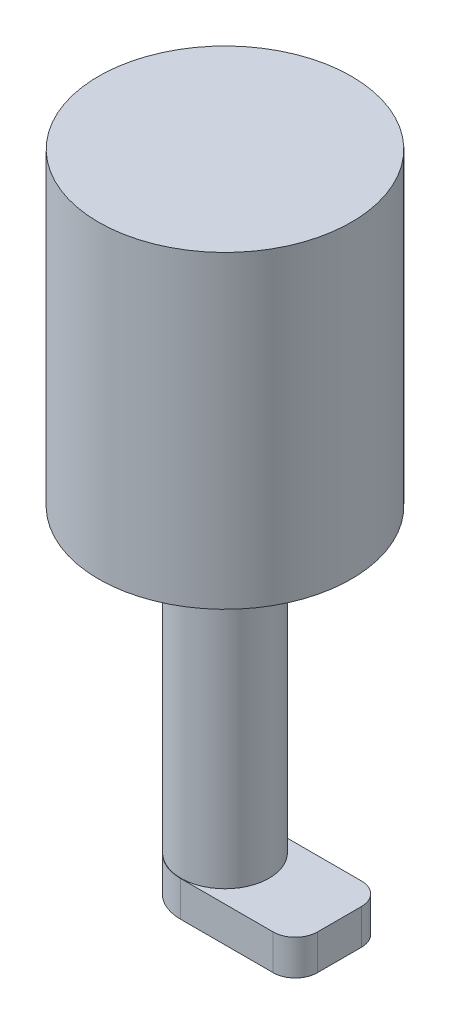
ISO-10303-21;
HEADER;
FILE_DESCRIPTION(('STEP AP214'),'2;1');
FILE_NAME('part.step','',(''),(''),'','','');
FILE_SCHEMA(('AUTOMOTIVE_DESIGN { 1 0 10303 214 1 1 1 1 }'));
ENDSEC;
DATA;
#1=APPLICATION_CONTEXT('core data for automotive mechanical design processes');
#2=APPLICATION_PROTOCOL_DEFINITION('international standard','automotive_design',2000,#1);
#3=PRODUCT_CONTEXT('',#1,'mechanical');
#4=PRODUCT('Part','Part','',(#3));
#5=PRODUCT_RELATED_PRODUCT_CATEGORY('part','',(#4));
#6=PRODUCT_DEFINITION_FORMATION('','',#4);
#7=PRODUCT_DEFINITION_CONTEXT('part definition',#1,'design');
#8=PRODUCT_DEFINITION('design','',#6,#7);
#9=PRODUCT_DEFINITION_SHAPE('','',#8);
#10=(LENGTH_UNIT() NAMED_UNIT(*) SI_UNIT(.MILLI.,.METRE.));
#11=(NAMED_UNIT(*) PLANE_ANGLE_UNIT() SI_UNIT($,.RADIAN.));
#12=(NAMED_UNIT(*) SI_UNIT($,.STERADIAN.) SOLID_ANGLE_UNIT());
#13=UNCERTAINTY_MEASURE_WITH_UNIT(LENGTH_MEASURE(1.E-05),#10,'distance_accuracy_value','');
#14=(GEOMETRIC_REPRESENTATION_CONTEXT(3) GLOBAL_UNCERTAINTY_ASSIGNED_CONTEXT((#13)) GLOBAL_UNIT_ASSIGNED_CONTEXT((#10,
#11,#12)) REPRESENTATION_CONTEXT('',''));
#15=CARTESIAN_POINT('',(0.,0.,0.));
#16=DIRECTION('',(0.,0.,1.));
#17=DIRECTION('',(1.,0.,0.));
#18=AXIS2_PLACEMENT_3D('',#15,#16,#17);
#19=CARTESIAN_POINT('',(0.,70.,0.));
#20=DIRECTION('',(0.,-1.,0.));
#21=DIRECTION('',(0.,0.,-1.));
#22=AXIS2_PLACEMENT_3D('',#19,#20,#21);
#23=CYLINDRICAL_SURFACE('',#22,28.64);
#24=CARTESIAN_POINT('',(0.,70.,0.));
#25=DIRECTION('',(0.,1.,0.));
#26=DIRECTION('',(0.,0.,1.));
#27=AXIS2_PLACEMENT_3D('',#24,#25,#26);
#28=CIRCLE('',#27,28.64);
#29=CARTESIAN_POINT('',(0.,70.,28.64));
#30=VERTEX_POINT('',#29);
#31=EDGE_CURVE('E152',#30,#30,#28,.T.);
#32=ORIENTED_EDGE('',*,*,#31,.F.);
#33=EDGE_LOOP('',(#32));
#34=FACE_BOUND('',#33,.T.);
#35=CARTESIAN_POINT('',(0.,0.,0.));
#36=DIRECTION('',(0.,1.,0.));
#37=DIRECTION('',(0.,0.,1.));
#38=AXIS2_PLACEMENT_3D('',#35,#36,#37);
#39=CIRCLE('',#38,28.64);
#40=CARTESIAN_POINT('',(0.,0.,28.64));
#41=VERTEX_POINT('',#40);
#42=EDGE_CURVE('E128',#41,#41,#39,.T.);
#43=ORIENTED_EDGE('',*,*,#42,.T.);
#44=EDGE_LOOP('',(#43));
#45=FACE_BOUND('',#44,.T.);
#46=ADVANCED_FACE('F39',(#34,#45),#23,.T.);
#47=CARTESIAN_POINT('',(0.,70.,0.));
#48=DIRECTION('',(0.,1.,0.));
#49=DIRECTION('',(0.,0.,1.));
#50=AXIS2_PLACEMENT_3D('',#47,#48,#49);
#51=PLANE('',#50);
#52=ORIENTED_EDGE('',*,*,#31,.T.);
#53=EDGE_LOOP('',(#52));
#54=FACE_BOUND('',#53,.T.);
#55=ADVANCED_FACE('F222',(#54),#51,.T.);
#56=CARTESIAN_POINT('',(0.,0.,0.));
#57=DIRECTION('',(0.,1.,0.));
#58=DIRECTION('',(0.,0.,1.));
#59=AXIS2_PLACEMENT_3D('',#56,#57,#58);
#60=PLANE('',#59);
#61=CARTESIAN_POINT('',(0.,0.,0.));
#62=DIRECTION('',(0.,-1.,0.));
#63=DIRECTION('',(0.,0.,-1.));
#64=AXIS2_PLACEMENT_3D('',#61,#62,#63);
#65=CIRCLE('',#64,10.);
#66=CARTESIAN_POINT('',(0.,0.,-10.));
#67=VERTEX_POINT('',#66);
#68=EDGE_CURVE('E118',#67,#67,#65,.T.);
#69=ORIENTED_EDGE('',*,*,#68,.F.);
#70=EDGE_LOOP('',(#69));
#71=FACE_BOUND('',#70,.T.);
#72=ORIENTED_EDGE('',*,*,#42,.F.);
#73=EDGE_LOOP('',(#72));
#74=FACE_BOUND('',#73,.T.);
#75=ADVANCED_FACE('F228',(#71,#74),#60,.F.);
#76=CARTESIAN_POINT('',(0.,-68.,0.));
#77=DIRECTION('',(0.,1.,0.));
#78=DIRECTION('',(0.,0.,1.));
#79=AXIS2_PLACEMENT_3D('',#76,#77,#78);
#80=CYLINDRICAL_SURFACE('',#79,10.);
#81=CARTESIAN_POINT('',(0.,-68.,0.));
#82=DIRECTION('',(0.,-1.,0.));
#83=DIRECTION('',(0.,0.,-1.));
#84=AXIS2_PLACEMENT_3D('',#81,#82,#83);
#85=CIRCLE('',#84,10.);
#86=CARTESIAN_POINT('',(1.24230705666228,-68.,-9.92253360674415));
#87=VERTEX_POINT('',#86);
#88=CARTESIAN_POINT('',(-9.9999249866926,-68.,0.038733196627476));
#89=VERTEX_POINT('',#88);
#90=EDGE_CURVE('E122',#87,#89,#85,.T.);
#91=ORIENTED_EDGE('',*,*,#90,.F.);
#92=EDGE_CURVE('E125',#89,#87,#85,.T.);
#93=ORIENTED_EDGE('',*,*,#92,.F.);
#94=EDGE_LOOP('',(#91,#93));
#95=FACE_BOUND('',#94,.T.);
#96=ORIENTED_EDGE('',*,*,#68,.T.);
#97=EDGE_LOOP('',(#96));
#98=FACE_BOUND('',#97,.T.);
#99=ADVANCED_FACE('F123',(#95,#98),#80,.T.);
#100=CARTESIAN_POINT('',(0.,-68.,0.));
#101=DIRECTION('',(0.,-1.,0.));
#102=DIRECTION('',(0.,0.,-1.));
#103=AXIS2_PLACEMENT_3D('',#100,#101,#102);
#104=PLANE('',#103);
#105=DIRECTION('',(1.,0.,0.));
#106=VECTOR('',#105,1.);
#107=CARTESIAN_POINT('',(26.,-68.,-9.92253360674415));
#108=LINE('',#107,#106);
#109=CARTESIAN_POINT('',(0.,-68.,-9.92253360674415));
#110=VERTEX_POINT('',#109);
#111=EDGE_CURVE('E107',#110,#87,#108,.T.);
#112=ORIENTED_EDGE('',*,*,#111,.F.);
#113=CARTESIAN_POINT('',(0.,-68.,0.0774663932558477));
#114=DIRECTION('',(0.,-1.,0.));
#115=DIRECTION('',(0.,0.,-1.));
#116=AXIS2_PLACEMENT_3D('',#113,#114,#115);
#117=CIRCLE('',#116,10.);
#118=EDGE_CURVE('E131',#110,#89,#117,.F.);
#119=ORIENTED_EDGE('',*,*,#118,.T.);
#120=ORIENTED_EDGE('',*,*,#92,.T.);
#121=EDGE_LOOP('',(#112,#119,#120));
#122=FACE_BOUND('',#121,.T.);
#123=ADVANCED_FACE('F130',(#122),#104,.T.);
#124=CARTESIAN_POINT('',(0.,-68.,0.));
#125=DIRECTION('',(0.,-1.,0.));
#126=DIRECTION('',(0.,0.,-1.));
#127=AXIS2_PLACEMENT_3D('',#124,#125,#126);
#128=PLANE('',#127);
#129=DIRECTION('',(0.,0.,1.));
#130=VECTOR('',#129,1.);
#131=CARTESIAN_POINT('',(26.,-68.,-9.92253360674415));
#132=LINE('',#131,#130);
#133=CARTESIAN_POINT('',(26.,-68.,-4.92253360674415));
#134=VERTEX_POINT('',#133);
#135=CARTESIAN_POINT('',(26.,-68.,5.07746639325585));
#136=VERTEX_POINT('',#135);
#137=EDGE_CURVE('E145',#134,#136,#132,.T.);
#138=ORIENTED_EDGE('',*,*,#137,.F.);
#139=CARTESIAN_POINT('',(21.,-68.,-4.92253360674415));
#140=DIRECTION('',(0.,-1.,0.));
#141=DIRECTION('',(0.,0.,-1.));
#142=AXIS2_PLACEMENT_3D('',#139,#140,#141);
#143=CIRCLE('',#142,5.);
#144=CARTESIAN_POINT('',(21.,-68.,-9.92253360674415));
#145=VERTEX_POINT('',#144);
#146=EDGE_CURVE('E137',#134,#145,#143,.F.);
#147=ORIENTED_EDGE('',*,*,#146,.T.);
#148=EDGE_CURVE('E111',#87,#145,#108,.T.);
#149=ORIENTED_EDGE('',*,*,#148,.F.);
#150=ORIENTED_EDGE('',*,*,#90,.T.);
#151=CARTESIAN_POINT('',(0.,-68.,0.0774663932558477));
#152=DIRECTION('',(0.,-1.,0.));
#153=DIRECTION('',(0.,0.,-1.));
#154=AXIS2_PLACEMENT_3D('',#151,#152,#153);
#155=CIRCLE('',#154,10.);
#156=CARTESIAN_POINT('',(-10.,-68.,0.0774663932558498));
#157=VERTEX_POINT('',#156);
#158=EDGE_CURVE('E165',#89,#157,#155,.F.);
#159=ORIENTED_EDGE('',*,*,#158,.T.);
#160=CARTESIAN_POINT('',(0.,-68.,0.0774663932558498));
#161=DIRECTION('',(0.,-1.,0.));
#162=DIRECTION('',(0.,0.,-1.));
#163=AXIS2_PLACEMENT_3D('',#160,#161,#162);
#164=CIRCLE('',#163,10.);
#165=CARTESIAN_POINT('',(0.,-68.,10.0774663932559));
#166=VERTEX_POINT('',#165);
#167=EDGE_CURVE('E161',#157,#166,#164,.F.);
#168=ORIENTED_EDGE('',*,*,#167,.T.);
#169=DIRECTION('',(-1.,0.,0.));
#170=VECTOR('',#169,1.);
#171=CARTESIAN_POINT('',(26.,-68.,10.0774663932559));
#172=LINE('',#171,#170);
#173=CARTESIAN_POINT('',(21.,-68.,10.0774663932559));
#174=VERTEX_POINT('',#173);
#175=EDGE_CURVE('E140',#174,#166,#172,.T.);
#176=ORIENTED_EDGE('',*,*,#175,.F.);
#177=CARTESIAN_POINT('',(21.,-68.,5.07746639325585));
#178=DIRECTION('',(0.,-1.,0.));
#179=DIRECTION('',(0.,0.,-1.));
#180=AXIS2_PLACEMENT_3D('',#177,#178,#179);
#181=CIRCLE('',#180,5.);
#182=EDGE_CURVE('E191',#174,#136,#181,.F.);
#183=ORIENTED_EDGE('',*,*,#182,.T.);
#184=EDGE_LOOP('',(#138,#147,#149,#150,#159,#168,#176,#183));
#185=FACE_BOUND('',#184,.T.);
#186=ADVANCED_FACE('F136',(#185),#128,.F.);
#187=CARTESIAN_POINT('',(26.,-76.,-9.92253360674415));
#188=DIRECTION('',(-1.,0.,0.));
#189=DIRECTION('',(0.,0.,1.));
#190=AXIS2_PLACEMENT_3D('',#187,#188,#189);
#191=PLANE('',#190);
#192=DIRECTION('',(0.,0.,1.));
#193=VECTOR('',#192,1.);
#194=CARTESIAN_POINT('',(26.,-76.,-9.92253360674415));
#195=LINE('',#194,#193);
#196=CARTESIAN_POINT('',(26.,-76.,-4.92253360674415));
#197=VERTEX_POINT('',#196);
#198=CARTESIAN_POINT('',(26.,-76.,5.07746639325585));
#199=VERTEX_POINT('',#198);
#200=EDGE_CURVE('E139',#197,#199,#195,.T.);
#201=ORIENTED_EDGE('',*,*,#200,.F.);
#202=DIRECTION('',(0.,1.,0.));
#203=VECTOR('',#202,1.);
#204=CARTESIAN_POINT('',(26.,-76.,-4.92253360674415));
#205=LINE('',#204,#203);
#206=EDGE_CURVE('E187',#197,#134,#205,.T.);
#207=ORIENTED_EDGE('',*,*,#206,.T.);
#208=ORIENTED_EDGE('',*,*,#137,.T.);
#209=DIRECTION('',(0.,1.,0.));
#210=VECTOR('',#209,1.);
#211=CARTESIAN_POINT('',(26.,-76.,5.07746639325585));
#212=LINE('',#211,#210);
#213=EDGE_CURVE('E180',#136,#199,#212,.F.);
#214=ORIENTED_EDGE('',*,*,#213,.T.);
#215=EDGE_LOOP('',(#201,#207,#208,#214));
#216=FACE_BOUND('',#215,.T.);
#217=ADVANCED_FACE('F206',(#216),#191,.F.);
#218=CARTESIAN_POINT('',(26.,-76.,10.0774663932559));
#219=DIRECTION('',(0.,0.,-1.));
#220=DIRECTION('',(-1.,0.,0.));
#221=AXIS2_PLACEMENT_3D('',#218,#219,#220);
#222=PLANE('',#221);
#223=DIRECTION('',(-1.,0.,0.));
#224=VECTOR('',#223,1.);
#225=CARTESIAN_POINT('',(26.,-76.,10.0774663932559));
#226=LINE('',#225,#224);
#227=CARTESIAN_POINT('',(21.,-76.,10.0774663932559));
#228=VERTEX_POINT('',#227);
#229=CARTESIAN_POINT('',(0.,-76.,10.0774663932559));
#230=VERTEX_POINT('',#229);
#231=EDGE_CURVE('E143',#228,#230,#226,.T.);
#232=ORIENTED_EDGE('',*,*,#231,.F.);
#233=DIRECTION('',(0.,1.,0.));
#234=VECTOR('',#233,1.);
#235=CARTESIAN_POINT('',(21.,-76.,10.0774663932559));
#236=LINE('',#235,#234);
#237=EDGE_CURVE('E11',#228,#174,#236,.T.);
#238=ORIENTED_EDGE('',*,*,#237,.T.);
#239=ORIENTED_EDGE('',*,*,#175,.T.);
#240=DIRECTION('',(0.,1.,0.));
#241=VECTOR('',#240,1.);
#242=CARTESIAN_POINT('',(0.,-76.,10.0774663932559));
#243=LINE('',#242,#241);
#244=EDGE_CURVE('E174',#166,#230,#243,.F.);
#245=ORIENTED_EDGE('',*,*,#244,.T.);
#246=EDGE_LOOP('',(#232,#238,#239,#245));
#247=FACE_BOUND('',#246,.T.);
#248=ADVANCED_FACE('F253',(#247),#222,.F.);
#249=CARTESIAN_POINT('',(26.,-76.,-9.92253360674415));
#250=DIRECTION('',(0.,0.,1.));
#251=DIRECTION('',(1.,0.,0.));
#252=AXIS2_PLACEMENT_3D('',#249,#250,#251);
#253=PLANE('',#252);
#254=ORIENTED_EDGE('',*,*,#148,.T.);
#255=DIRECTION('',(0.,1.,0.));
#256=VECTOR('',#255,1.);
#257=CARTESIAN_POINT('',(21.,-76.,-9.92253360674415));
#258=LINE('',#257,#256);
#259=CARTESIAN_POINT('',(21.,-76.,-9.92253360674415));
#260=VERTEX_POINT('',#259);
#261=EDGE_CURVE('E63',#145,#260,#258,.F.);
#262=ORIENTED_EDGE('',*,*,#261,.T.);
#263=DIRECTION('',(1.,0.,0.));
#264=VECTOR('',#263,1.);
#265=CARTESIAN_POINT('',(26.,-76.,-9.92253360674415));
#266=LINE('',#265,#264);
#267=CARTESIAN_POINT('',(0.,-76.,-9.92253360674415));
#268=VERTEX_POINT('',#267);
#269=EDGE_CURVE('E134',#268,#260,#266,.T.);
#270=ORIENTED_EDGE('',*,*,#269,.F.);
#271=DIRECTION('',(0.,1.,0.));
#272=VECTOR('',#271,1.);
#273=CARTESIAN_POINT('',(0.,-76.,-9.92253360674415));
#274=LINE('',#273,#272);
#275=EDGE_CURVE('E113',#268,#110,#274,.T.);
#276=ORIENTED_EDGE('',*,*,#275,.T.);
#277=ORIENTED_EDGE('',*,*,#111,.T.);
#278=EDGE_LOOP('',(#254,#262,#270,#276,#277));
#279=FACE_BOUND('',#278,.T.);
#280=ADVANCED_FACE('F109',(#279),#253,.F.);
#281=CARTESIAN_POINT('',(0.,-76.,0.));
#282=DIRECTION('',(0.,-1.,0.));
#283=DIRECTION('',(0.,0.,-1.));
#284=AXIS2_PLACEMENT_3D('',#281,#282,#283);
#285=PLANE('',#284);
#286=ORIENTED_EDGE('',*,*,#269,.T.);
#287=CARTESIAN_POINT('',(21.,-76.,-4.92253360674415));
#288=DIRECTION('',(0.,-1.,0.));
#289=DIRECTION('',(0.,0.,-1.));
#290=AXIS2_PLACEMENT_3D('',#287,#288,#289);
#291=CIRCLE('',#290,5.);
#292=EDGE_CURVE('E48',#260,#197,#291,.T.);
#293=ORIENTED_EDGE('',*,*,#292,.T.);
#294=ORIENTED_EDGE('',*,*,#200,.T.);
#295=CARTESIAN_POINT('',(21.,-76.,5.07746639325585));
#296=DIRECTION('',(0.,-1.,0.));
#297=DIRECTION('',(0.,0.,-1.));
#298=AXIS2_PLACEMENT_3D('',#295,#296,#297);
#299=CIRCLE('',#298,5.);
#300=EDGE_CURVE('E55',#199,#228,#299,.T.);
#301=ORIENTED_EDGE('',*,*,#300,.T.);
#302=ORIENTED_EDGE('',*,*,#231,.T.);
#303=CARTESIAN_POINT('',(0.,-76.,0.0774663932558498));
#304=DIRECTION('',(0.,-1.,0.));
#305=DIRECTION('',(0.,0.,-1.));
#306=AXIS2_PLACEMENT_3D('',#303,#304,#305);
#307=CIRCLE('',#306,10.);
#308=CARTESIAN_POINT('',(-10.,-76.,0.0774663932558498));
#309=VERTEX_POINT('',#308);
#310=EDGE_CURVE('E168',#230,#309,#307,.T.);
#311=ORIENTED_EDGE('',*,*,#310,.T.);
#312=CARTESIAN_POINT('',(0.,-76.,0.0774663932558477));
#313=DIRECTION('',(0.,-1.,0.));
#314=DIRECTION('',(0.,0.,-1.));
#315=AXIS2_PLACEMENT_3D('',#312,#313,#314);
#316=CIRCLE('',#315,10.);
#317=EDGE_CURVE('E171',#309,#268,#316,.T.);
#318=ORIENTED_EDGE('',*,*,#317,.T.);
#319=EDGE_LOOP('',(#286,#293,#294,#301,#302,#311,#318));
#320=FACE_BOUND('',#319,.T.);
#321=ADVANCED_FACE('F202',(#320),#285,.T.);
#322=CARTESIAN_POINT('',(0.,-76.,0.0774663932558498));
#323=DIRECTION('',(0.,1.,0.));
#324=DIRECTION('',(0.,0.,1.));
#325=AXIS2_PLACEMENT_3D('',#322,#323,#324);
#326=CYLINDRICAL_SURFACE('',#325,10.);
#327=DIRECTION('',(0.,1.,0.));
#328=VECTOR('',#327,1.);
#329=CARTESIAN_POINT('',(-10.,-76.,0.0774663932558498));
#330=LINE('',#329,#328);
#331=EDGE_CURVE('E181',#309,#157,#330,.T.);
#332=ORIENTED_EDGE('',*,*,#331,.F.);
#333=ORIENTED_EDGE('',*,*,#310,.F.);
#334=ORIENTED_EDGE('',*,*,#244,.F.);
#335=ORIENTED_EDGE('',*,*,#167,.F.);
#336=EDGE_LOOP('',(#332,#333,#334,#335));
#337=FACE_BOUND('',#336,.T.);
#338=ADVANCED_FACE('F217',(#337),#326,.T.);
#339=CARTESIAN_POINT('',(0.,-76.,0.0774663932558477));
#340=DIRECTION('',(0.,1.,0.));
#341=DIRECTION('',(0.,0.,1.));
#342=AXIS2_PLACEMENT_3D('',#339,#340,#341);
#343=CYLINDRICAL_SURFACE('',#342,10.);
#344=ORIENTED_EDGE('',*,*,#317,.F.);
#345=ORIENTED_EDGE('',*,*,#331,.T.);
#346=ORIENTED_EDGE('',*,*,#158,.F.);
#347=ORIENTED_EDGE('',*,*,#118,.F.);
#348=ORIENTED_EDGE('',*,*,#275,.F.);
#349=EDGE_LOOP('',(#344,#345,#346,#347,#348));
#350=FACE_BOUND('',#349,.T.);
#351=ADVANCED_FACE('F211',(#350),#343,.T.);
#352=CARTESIAN_POINT('',(21.,-76.,-4.92253360674415));
#353=DIRECTION('',(0.,1.,0.));
#354=DIRECTION('',(0.,0.,1.));
#355=AXIS2_PLACEMENT_3D('',#352,#353,#354);
#356=CYLINDRICAL_SURFACE('',#355,5.);
#357=ORIENTED_EDGE('',*,*,#292,.F.);
#358=ORIENTED_EDGE('',*,*,#261,.F.);
#359=ORIENTED_EDGE('',*,*,#146,.F.);
#360=ORIENTED_EDGE('',*,*,#206,.F.);
#361=EDGE_LOOP('',(#357,#358,#359,#360));
#362=FACE_BOUND('',#361,.T.);
#363=ADVANCED_FACE('F209',(#362),#356,.T.);
#364=CARTESIAN_POINT('',(21.,-76.,5.07746639325585));
#365=DIRECTION('',(0.,1.,0.));
#366=DIRECTION('',(0.,0.,1.));
#367=AXIS2_PLACEMENT_3D('',#364,#365,#366);
#368=CYLINDRICAL_SURFACE('',#367,5.);
#369=ORIENTED_EDGE('',*,*,#300,.F.);
#370=ORIENTED_EDGE('',*,*,#213,.F.);
#371=ORIENTED_EDGE('',*,*,#182,.F.);
#372=ORIENTED_EDGE('',*,*,#237,.F.);
#373=EDGE_LOOP('',(#369,#370,#371,#372));
#374=FACE_BOUND('',#373,.T.);
#375=ADVANCED_FACE('F41',(#374),#368,.T.);
#376=CLOSED_SHELL('',(#46,#55,#75,#99,#123,#186,#217,#248,#280,#321,#338,#351,#363,#375));
#377=MANIFOLD_SOLID_BREP('B2',#376);
#378=ADVANCED_BREP_SHAPE_REPRESENTATION('',(#18,#377),#14);
#379=SHAPE_DEFINITION_REPRESENTATION(#9,#378);
ENDSEC;
END-ISO-10303-21;
